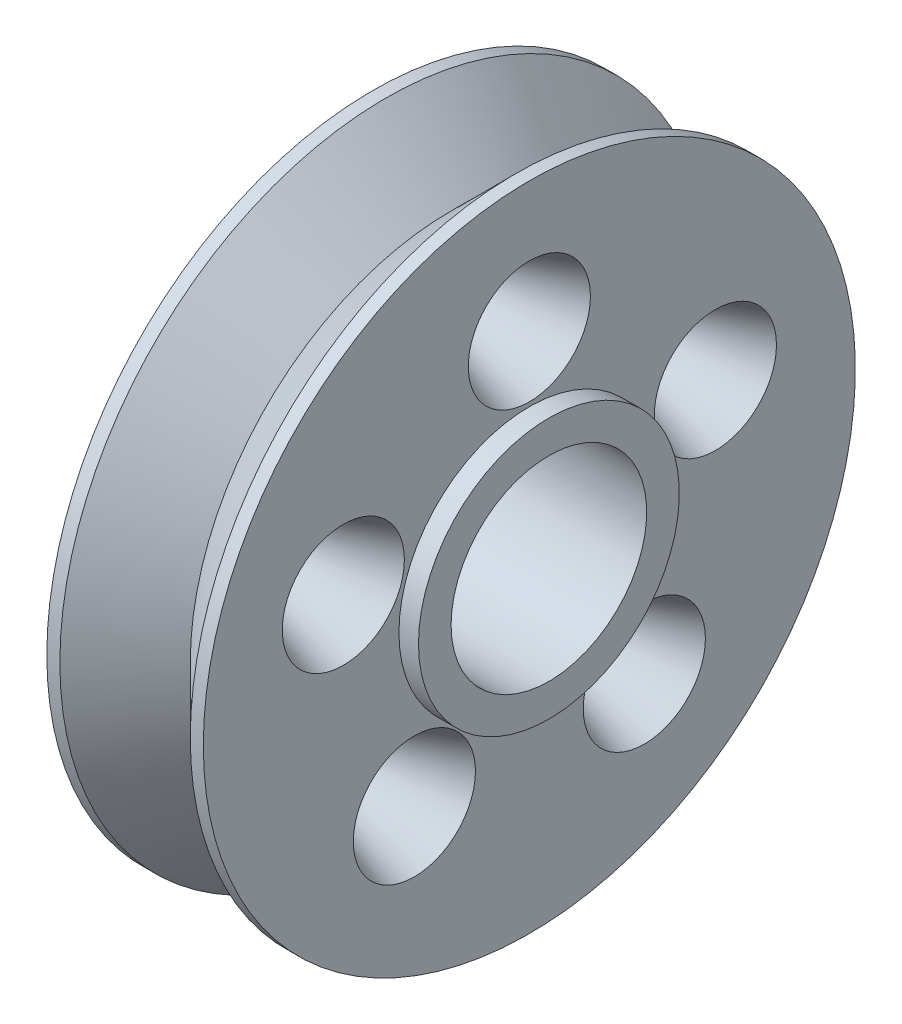
ISO-10303-21;
HEADER;
FILE_DESCRIPTION(('STEP AP214'),'2;1');
FILE_NAME('part.step','',(''),(''),'','','');
FILE_SCHEMA(('AUTOMOTIVE_DESIGN { 1 0 10303 214 1 1 1 1 }'));
ENDSEC;
DATA;
#1=APPLICATION_CONTEXT('core data for automotive mechanical design processes');
#2=APPLICATION_PROTOCOL_DEFINITION('international standard','automotive_design',2000,#1);
#3=PRODUCT_CONTEXT('',#1,'mechanical');
#4=PRODUCT('Part','Part','',(#3));
#5=PRODUCT_RELATED_PRODUCT_CATEGORY('part','',(#4));
#6=PRODUCT_DEFINITION_FORMATION('','',#4);
#7=PRODUCT_DEFINITION_CONTEXT('part definition',#1,'design');
#8=PRODUCT_DEFINITION('design','',#6,#7);
#9=PRODUCT_DEFINITION_SHAPE('','',#8);
#10=(LENGTH_UNIT() NAMED_UNIT(*) SI_UNIT(.MILLI.,.METRE.));
#11=(NAMED_UNIT(*) PLANE_ANGLE_UNIT() SI_UNIT($,.RADIAN.));
#12=(NAMED_UNIT(*) SI_UNIT($,.STERADIAN.) SOLID_ANGLE_UNIT());
#13=UNCERTAINTY_MEASURE_WITH_UNIT(LENGTH_MEASURE(1.E-05),#10,'distance_accuracy_value','');
#14=(GEOMETRIC_REPRESENTATION_CONTEXT(3) GLOBAL_UNCERTAINTY_ASSIGNED_CONTEXT((#13)) GLOBAL_UNIT_ASSIGNED_CONTEXT((#10,
#11,#12)) REPRESENTATION_CONTEXT('',''));
#15=CARTESIAN_POINT('',(0.,0.,0.));
#16=DIRECTION('',(0.,0.,1.));
#17=DIRECTION('',(1.,0.,0.));
#18=AXIS2_PLACEMENT_3D('',#15,#16,#17);
#19=CARTESIAN_POINT('',(-12.1366351418616,50.,0.));
#20=DIRECTION('',(1.,0.,0.));
#21=DIRECTION('',(0.,0.,-1.));
#22=AXIS2_PLACEMENT_3D('',#19,#20,#21);
#23=PLANE('',#22);
#24=CARTESIAN_POINT('',(-12.1366351418616,9.27050983124875,-28.5316954888545));
#25=DIRECTION('',(1.,0.,0.));
#26=DIRECTION('',(0.,0.,-1.));
#27=AXIS2_PLACEMENT_3D('',#24,#25,#26);
#28=CIRCLE('',#27,9.36764281119444);
#29=CARTESIAN_POINT('',(-12.1366351418616,9.27050983124875,-37.8993383000489));
#30=VERTEX_POINT('',#29);
#31=EDGE_CURVE('E128',#30,#30,#28,.T.);
#32=ORIENTED_EDGE('',*,*,#31,.T.);
#33=EDGE_LOOP('',(#32));
#34=FACE_BOUND('',#33,.T.);
#35=CARTESIAN_POINT('',(-12.1366351418616,-24.2705098312483,-17.6335575687744));
#36=DIRECTION('',(1.,0.,0.));
#37=DIRECTION('',(0.,0.,-1.));
#38=AXIS2_PLACEMENT_3D('',#35,#36,#37);
#39=CIRCLE('',#38,9.36764281119444);
#40=CARTESIAN_POINT('',(-12.1366351418616,-24.2705098312483,-27.0012003799688));
#41=VERTEX_POINT('',#40);
#42=EDGE_CURVE('E141',#41,#41,#39,.T.);
#43=ORIENTED_EDGE('',*,*,#42,.T.);
#44=EDGE_LOOP('',(#43));
#45=FACE_BOUND('',#44,.T.);
#46=CARTESIAN_POINT('',(-12.1366351418616,-24.2705098312485,17.6335575687741));
#47=DIRECTION('',(1.,0.,0.));
#48=DIRECTION('',(0.,0.,-1.));
#49=AXIS2_PLACEMENT_3D('',#46,#47,#48);
#50=CIRCLE('',#49,9.36764281119444);
#51=CARTESIAN_POINT('',(-12.1366351418616,-24.2705098312485,8.26591475757962));
#52=VERTEX_POINT('',#51);
#53=EDGE_CURVE('E151',#52,#52,#50,.T.);
#54=ORIENTED_EDGE('',*,*,#53,.T.);
#55=EDGE_LOOP('',(#54));
#56=FACE_BOUND('',#55,.T.);
#57=CARTESIAN_POINT('',(-12.1366351418616,9.27050983124834,28.5316954888546));
#58=DIRECTION('',(1.,0.,0.));
#59=DIRECTION('',(0.,0.,-1.));
#60=AXIS2_PLACEMENT_3D('',#57,#58,#59);
#61=CIRCLE('',#60,9.36764281119444);
#62=CARTESIAN_POINT('',(-12.1366351418616,9.27050983124834,19.1640526776602));
#63=VERTEX_POINT('',#62);
#64=EDGE_CURVE('E114',#63,#63,#61,.T.);
#65=ORIENTED_EDGE('',*,*,#64,.T.);
#66=EDGE_LOOP('',(#65));
#67=FACE_BOUND('',#66,.T.);
#68=CARTESIAN_POINT('',(-12.1366351418616,30.,0.));
#69=DIRECTION('',(1.,0.,0.));
#70=DIRECTION('',(0.,0.,-1.));
#71=AXIS2_PLACEMENT_3D('',#68,#69,#70);
#72=CIRCLE('',#71,9.36764281119444);
#73=CARTESIAN_POINT('',(-12.1366351418616,30.,-9.36764281119444));
#74=VERTEX_POINT('',#73);
#75=EDGE_CURVE('E102',#74,#74,#72,.T.);
#76=ORIENTED_EDGE('',*,*,#75,.T.);
#77=EDGE_LOOP('',(#76));
#78=FACE_BOUND('',#77,.T.);
#79=CARTESIAN_POINT('',(-12.1366351418616,0.,0.));
#80=DIRECTION('',(-1.,0.,0.));
#81=DIRECTION('',(0.,0.,1.));
#82=AXIS2_PLACEMENT_3D('',#79,#80,#81);
#83=CIRCLE('',#82,20.);
#84=CARTESIAN_POINT('',(-12.1366351418616,0.,20.));
#85=VERTEX_POINT('',#84);
#86=EDGE_CURVE('E94',#85,#85,#83,.T.);
#87=ORIENTED_EDGE('',*,*,#86,.F.);
#88=EDGE_LOOP('',(#87));
#89=FACE_BOUND('',#88,.T.);
#90=CARTESIAN_POINT('',(-12.1366351418616,0.,0.));
#91=DIRECTION('',(-1.,0.,0.));
#92=DIRECTION('',(0.,0.,1.));
#93=AXIS2_PLACEMENT_3D('',#90,#91,#92);
#94=CIRCLE('',#93,50.);
#95=CARTESIAN_POINT('',(-12.1366351418616,0.,50.));
#96=VERTEX_POINT('',#95);
#97=EDGE_CURVE('E10',#96,#96,#94,.T.);
#98=ORIENTED_EDGE('',*,*,#97,.T.);
#99=EDGE_LOOP('',(#98));
#100=FACE_BOUND('',#99,.T.);
#101=ADVANCED_FACE('F47',(#34,#45,#56,#67,#78,#89,#100),#23,.F.);
#102=CARTESIAN_POINT('',(-17.6767048282728,0.,0.));
#103=DIRECTION('',(-1.,0.,0.));
#104=DIRECTION('',(0.,0.,1.));
#105=AXIS2_PLACEMENT_3D('',#102,#103,#104);
#106=CYLINDRICAL_SURFACE('',#105,50.);
#107=ORIENTED_EDGE('',*,*,#97,.F.);
#108=EDGE_LOOP('',(#107));
#109=FACE_BOUND('',#108,.T.);
#110=CARTESIAN_POINT('',(-10.1366351418613,0.,0.));
#111=DIRECTION('',(-1.,0.,0.));
#112=DIRECTION('',(0.,0.,1.));
#113=AXIS2_PLACEMENT_3D('',#110,#111,#112);
#114=CIRCLE('',#113,50.);
#115=CARTESIAN_POINT('',(-10.1366351418613,0.,50.));
#116=VERTEX_POINT('',#115);
#117=EDGE_CURVE('E54',#116,#116,#114,.T.);
#118=ORIENTED_EDGE('',*,*,#117,.T.);
#119=EDGE_LOOP('',(#118));
#120=FACE_BOUND('',#119,.T.);
#121=ADVANCED_FACE('F178',(#109,#120),#106,.T.);
#122=CARTESIAN_POINT('',(-0.136635141861612,0.,0.));
#123=DIRECTION('',(-1.,0.,0.));
#124=DIRECTION('',(0.,0.,1.));
#125=AXIS2_PLACEMENT_3D('',#122,#123,#124);
#126=CONICAL_SURFACE('',#125,40.,0.785398163397464);
#127=ORIENTED_EDGE('',*,*,#117,.F.);
#128=EDGE_LOOP('',(#127));
#129=FACE_BOUND('',#128,.T.);
#130=CARTESIAN_POINT('',(-0.136635141861612,0.,0.));
#131=DIRECTION('',(-1.,0.,0.));
#132=DIRECTION('',(0.,0.,1.));
#133=AXIS2_PLACEMENT_3D('',#130,#131,#132);
#134=CIRCLE('',#133,40.);
#135=CARTESIAN_POINT('',(-0.136635141861612,0.,40.));
#136=VERTEX_POINT('',#135);
#137=EDGE_CURVE('E59',#136,#136,#134,.T.);
#138=ORIENTED_EDGE('',*,*,#137,.T.);
#139=EDGE_LOOP('',(#138));
#140=FACE_BOUND('',#139,.T.);
#141=ADVANCED_FACE('F183',(#129,#140),#126,.T.);
#142=CARTESIAN_POINT('',(9.86336485813861,0.,0.));
#143=DIRECTION('',(1.,0.,0.));
#144=DIRECTION('',(0.,0.,-1.));
#145=AXIS2_PLACEMENT_3D('',#142,#143,#144);
#146=CONICAL_SURFACE('',#145,50.,0.785398163397437);
#147=ORIENTED_EDGE('',*,*,#137,.F.);
#148=EDGE_LOOP('',(#147));
#149=FACE_BOUND('',#148,.T.);
#150=CARTESIAN_POINT('',(9.86336485813861,0.,0.));
#151=DIRECTION('',(-1.,0.,0.));
#152=DIRECTION('',(0.,0.,1.));
#153=AXIS2_PLACEMENT_3D('',#150,#151,#152);
#154=CIRCLE('',#153,50.);
#155=CARTESIAN_POINT('',(9.86336485813861,0.,50.));
#156=VERTEX_POINT('',#155);
#157=EDGE_CURVE('E64',#156,#156,#154,.T.);
#158=ORIENTED_EDGE('',*,*,#157,.T.);
#159=EDGE_LOOP('',(#158));
#160=FACE_BOUND('',#159,.T.);
#161=ADVANCED_FACE('F234',(#149,#160),#146,.T.);
#162=CARTESIAN_POINT('',(-17.6767048282728,0.,0.));
#163=DIRECTION('',(-1.,0.,0.));
#164=DIRECTION('',(0.,0.,1.));
#165=AXIS2_PLACEMENT_3D('',#162,#163,#164);
#166=CYLINDRICAL_SURFACE('',#165,50.);
#167=ORIENTED_EDGE('',*,*,#157,.F.);
#168=EDGE_LOOP('',(#167));
#169=FACE_BOUND('',#168,.T.);
#170=CARTESIAN_POINT('',(11.8633648581384,0.,0.));
#171=DIRECTION('',(-1.,0.,0.));
#172=DIRECTION('',(0.,0.,1.));
#173=AXIS2_PLACEMENT_3D('',#170,#171,#172);
#174=CIRCLE('',#173,50.);
#175=CARTESIAN_POINT('',(11.8633648581384,0.,50.));
#176=VERTEX_POINT('',#175);
#177=EDGE_CURVE('E70',#176,#176,#174,.T.);
#178=ORIENTED_EDGE('',*,*,#177,.T.);
#179=EDGE_LOOP('',(#178));
#180=FACE_BOUND('',#179,.T.);
#181=ADVANCED_FACE('F230',(#169,#180),#166,.T.);
#182=CARTESIAN_POINT('',(11.8633648581384,50.,0.));
#183=DIRECTION('',(-1.,0.,0.));
#184=DIRECTION('',(0.,0.,1.));
#185=AXIS2_PLACEMENT_3D('',#182,#183,#184);
#186=PLANE('',#185);
#187=CARTESIAN_POINT('',(11.8633648581384,9.27050983124875,-28.5316954888545));
#188=DIRECTION('',(1.,0.,0.));
#189=DIRECTION('',(0.,0.,-1.));
#190=AXIS2_PLACEMENT_3D('',#187,#188,#189);
#191=CIRCLE('',#190,9.36764281119444);
#192=CARTESIAN_POINT('',(11.8633648581384,9.27050983124875,-37.8993383000489));
#193=VERTEX_POINT('',#192);
#194=EDGE_CURVE('E123',#193,#193,#191,.T.);
#195=ORIENTED_EDGE('',*,*,#194,.F.);
#196=EDGE_LOOP('',(#195));
#197=FACE_BOUND('',#196,.T.);
#198=CARTESIAN_POINT('',(11.8633648581384,-24.2705098312483,-17.6335575687744));
#199=DIRECTION('',(1.,0.,0.));
#200=DIRECTION('',(0.,0.,-1.));
#201=AXIS2_PLACEMENT_3D('',#198,#199,#200);
#202=CIRCLE('',#201,9.36764281119444);
#203=CARTESIAN_POINT('',(11.8633648581384,-24.2705098312483,-27.0012003799688));
#204=VERTEX_POINT('',#203);
#205=EDGE_CURVE('E136',#204,#204,#202,.T.);
#206=ORIENTED_EDGE('',*,*,#205,.F.);
#207=EDGE_LOOP('',(#206));
#208=FACE_BOUND('',#207,.T.);
#209=CARTESIAN_POINT('',(11.8633648581384,-24.2705098312485,17.6335575687741));
#210=DIRECTION('',(1.,0.,0.));
#211=DIRECTION('',(0.,0.,-1.));
#212=AXIS2_PLACEMENT_3D('',#209,#210,#211);
#213=CIRCLE('',#212,9.36764281119444);
#214=CARTESIAN_POINT('',(11.8633648581384,-24.2705098312485,8.26591475757962));
#215=VERTEX_POINT('',#214);
#216=EDGE_CURVE('E122',#215,#215,#213,.T.);
#217=ORIENTED_EDGE('',*,*,#216,.F.);
#218=EDGE_LOOP('',(#217));
#219=FACE_BOUND('',#218,.T.);
#220=CARTESIAN_POINT('',(11.8633648581384,9.27050983124834,28.5316954888546));
#221=DIRECTION('',(1.,0.,0.));
#222=DIRECTION('',(0.,0.,-1.));
#223=AXIS2_PLACEMENT_3D('',#220,#221,#222);
#224=CIRCLE('',#223,9.36764281119444);
#225=CARTESIAN_POINT('',(11.8633648581384,9.27050983124834,19.1640526776602));
#226=VERTEX_POINT('',#225);
#227=EDGE_CURVE('E110',#226,#226,#224,.T.);
#228=ORIENTED_EDGE('',*,*,#227,.F.);
#229=EDGE_LOOP('',(#228));
#230=FACE_BOUND('',#229,.T.);
#231=CARTESIAN_POINT('',(11.8633648581384,30.,0.));
#232=DIRECTION('',(1.,0.,0.));
#233=DIRECTION('',(0.,0.,-1.));
#234=AXIS2_PLACEMENT_3D('',#231,#232,#233);
#235=CIRCLE('',#234,9.36764281119444);
#236=CARTESIAN_POINT('',(11.8633648581384,30.,-9.36764281119444));
#237=VERTEX_POINT('',#236);
#238=EDGE_CURVE('E98',#237,#237,#235,.T.);
#239=ORIENTED_EDGE('',*,*,#238,.F.);
#240=EDGE_LOOP('',(#239));
#241=FACE_BOUND('',#240,.T.);
#242=ORIENTED_EDGE('',*,*,#177,.F.);
#243=EDGE_LOOP('',(#242));
#244=FACE_BOUND('',#243,.T.);
#245=CARTESIAN_POINT('',(11.8633648581384,0.,0.));
#246=DIRECTION('',(-1.,0.,0.));
#247=DIRECTION('',(0.,0.,1.));
#248=AXIS2_PLACEMENT_3D('',#245,#246,#247);
#249=CIRCLE('',#248,20.);
#250=CARTESIAN_POINT('',(11.8633648581384,0.,20.));
#251=VERTEX_POINT('',#250);
#252=EDGE_CURVE('E74',#251,#251,#249,.T.);
#253=ORIENTED_EDGE('',*,*,#252,.T.);
#254=EDGE_LOOP('',(#253));
#255=FACE_BOUND('',#254,.T.);
#256=ADVANCED_FACE('F226',(#197,#208,#219,#230,#241,#244,#255),#186,.F.);
#257=CARTESIAN_POINT('',(-17.6767048282728,0.,0.));
#258=DIRECTION('',(-1.,0.,0.));
#259=DIRECTION('',(0.,0.,1.));
#260=AXIS2_PLACEMENT_3D('',#257,#258,#259);
#261=CYLINDRICAL_SURFACE('',#260,20.);
#262=ORIENTED_EDGE('',*,*,#252,.F.);
#263=EDGE_LOOP('',(#262));
#264=FACE_BOUND('',#263,.T.);
#265=CARTESIAN_POINT('',(14.8633648581384,0.,0.));
#266=DIRECTION('',(-1.,0.,0.));
#267=DIRECTION('',(0.,0.,1.));
#268=AXIS2_PLACEMENT_3D('',#265,#266,#267);
#269=CIRCLE('',#268,20.);
#270=CARTESIAN_POINT('',(14.8633648581384,0.,20.));
#271=VERTEX_POINT('',#270);
#272=EDGE_CURVE('E78',#271,#271,#269,.T.);
#273=ORIENTED_EDGE('',*,*,#272,.T.);
#274=EDGE_LOOP('',(#273));
#275=FACE_BOUND('',#274,.T.);
#276=ADVANCED_FACE('F222',(#264,#275),#261,.T.);
#277=CARTESIAN_POINT('',(14.8633648581384,15.,0.));
#278=DIRECTION('',(-1.,0.,0.));
#279=DIRECTION('',(0.,0.,1.));
#280=AXIS2_PLACEMENT_3D('',#277,#278,#279);
#281=PLANE('',#280);
#282=ORIENTED_EDGE('',*,*,#272,.F.);
#283=EDGE_LOOP('',(#282));
#284=FACE_BOUND('',#283,.T.);
#285=CARTESIAN_POINT('',(14.8633648581384,0.,0.));
#286=DIRECTION('',(-1.,0.,0.));
#287=DIRECTION('',(0.,0.,1.));
#288=AXIS2_PLACEMENT_3D('',#285,#286,#287);
#289=CIRCLE('',#288,15.);
#290=CARTESIAN_POINT('',(14.8633648581384,0.,15.));
#291=VERTEX_POINT('',#290);
#292=EDGE_CURVE('E82',#291,#291,#289,.T.);
#293=ORIENTED_EDGE('',*,*,#292,.T.);
#294=EDGE_LOOP('',(#293));
#295=FACE_BOUND('',#294,.T.);
#296=ADVANCED_FACE('F218',(#284,#295),#281,.F.);
#297=CARTESIAN_POINT('',(-17.6767048282728,0.,0.));
#298=DIRECTION('',(-1.,0.,0.));
#299=DIRECTION('',(0.,0.,1.));
#300=AXIS2_PLACEMENT_3D('',#297,#298,#299);
#301=CYLINDRICAL_SURFACE('',#300,15.);
#302=ORIENTED_EDGE('',*,*,#292,.F.);
#303=EDGE_LOOP('',(#302));
#304=FACE_BOUND('',#303,.T.);
#305=CARTESIAN_POINT('',(-15.1366351418616,0.,0.));
#306=DIRECTION('',(-1.,0.,0.));
#307=DIRECTION('',(0.,0.,1.));
#308=AXIS2_PLACEMENT_3D('',#305,#306,#307);
#309=CIRCLE('',#308,15.);
#310=CARTESIAN_POINT('',(-15.1366351418616,0.,15.));
#311=VERTEX_POINT('',#310);
#312=EDGE_CURVE('E86',#311,#311,#309,.T.);
#313=ORIENTED_EDGE('',*,*,#312,.T.);
#314=EDGE_LOOP('',(#313));
#315=FACE_BOUND('',#314,.T.);
#316=ADVANCED_FACE('F210',(#304,#315),#301,.F.);
#317=CARTESIAN_POINT('',(-15.1366351418616,15.,0.));
#318=DIRECTION('',(1.,0.,0.));
#319=DIRECTION('',(0.,0.,-1.));
#320=AXIS2_PLACEMENT_3D('',#317,#318,#319);
#321=PLANE('',#320);
#322=ORIENTED_EDGE('',*,*,#312,.F.);
#323=EDGE_LOOP('',(#322));
#324=FACE_BOUND('',#323,.T.);
#325=CARTESIAN_POINT('',(-15.1366351418616,0.,0.));
#326=DIRECTION('',(-1.,0.,0.));
#327=DIRECTION('',(0.,0.,1.));
#328=AXIS2_PLACEMENT_3D('',#325,#326,#327);
#329=CIRCLE('',#328,20.);
#330=CARTESIAN_POINT('',(-15.1366351418616,0.,20.));
#331=VERTEX_POINT('',#330);
#332=EDGE_CURVE('E90',#331,#331,#329,.T.);
#333=ORIENTED_EDGE('',*,*,#332,.T.);
#334=EDGE_LOOP('',(#333));
#335=FACE_BOUND('',#334,.T.);
#336=ADVANCED_FACE('F200',(#324,#335),#321,.F.);
#337=CARTESIAN_POINT('',(-17.6767048282728,0.,0.));
#338=DIRECTION('',(-1.,0.,0.));
#339=DIRECTION('',(0.,0.,1.));
#340=AXIS2_PLACEMENT_3D('',#337,#338,#339);
#341=CYLINDRICAL_SURFACE('',#340,20.);
#342=ORIENTED_EDGE('',*,*,#332,.F.);
#343=EDGE_LOOP('',(#342));
#344=FACE_BOUND('',#343,.T.);
#345=ORIENTED_EDGE('',*,*,#86,.T.);
#346=EDGE_LOOP('',(#345));
#347=FACE_BOUND('',#346,.T.);
#348=ADVANCED_FACE('F197',(#344,#347),#341,.T.);
#349=CARTESIAN_POINT('',(-0.136635141861627,30.,0.));
#350=DIRECTION('',(1.,0.,0.));
#351=DIRECTION('',(0.,0.,-1.));
#352=AXIS2_PLACEMENT_3D('',#349,#350,#351);
#353=CONICAL_SURFACE('',#352,5.,0.349065850398867);
#354=ORIENTED_EDGE('',*,*,#238,.T.);
#355=EDGE_LOOP('',(#354));
#356=FACE_BOUND('',#355,.T.);
#357=CARTESIAN_POINT('',(-0.136635141861627,30.,0.));
#358=DIRECTION('',(1.,0.,0.));
#359=DIRECTION('',(0.,0.,-1.));
#360=AXIS2_PLACEMENT_3D('',#357,#358,#359);
#361=CIRCLE('',#360,5.);
#362=CARTESIAN_POINT('',(-0.136635141861627,30.,-5.));
#363=VERTEX_POINT('',#362);
#364=EDGE_CURVE('E106',#363,#363,#361,.T.);
#365=ORIENTED_EDGE('',*,*,#364,.F.);
#366=EDGE_LOOP('',(#365));
#367=FACE_BOUND('',#366,.T.);
#368=ADVANCED_FACE('F199',(#356,#367),#353,.F.);
#369=CARTESIAN_POINT('',(-0.136635141861627,30.,0.));
#370=DIRECTION('',(-1.,0.,0.));
#371=DIRECTION('',(0.,0.,-1.));
#372=AXIS2_PLACEMENT_3D('',#369,#370,#371);
#373=CONICAL_SURFACE('',#372,5.,0.349065850398867);
#374=ORIENTED_EDGE('',*,*,#75,.F.);
#375=EDGE_LOOP('',(#374));
#376=FACE_BOUND('',#375,.T.);
#377=ORIENTED_EDGE('',*,*,#364,.T.);
#378=EDGE_LOOP('',(#377));
#379=FACE_BOUND('',#378,.T.);
#380=ADVANCED_FACE('F207',(#376,#379),#373,.F.);
#381=CARTESIAN_POINT('',(-0.136635141861627,9.27050983124834,28.5316954888546));
#382=DIRECTION('',(1.,0.,0.));
#383=DIRECTION('',(0.,0.951056516295155,-0.309016994374945));
#384=AXIS2_PLACEMENT_3D('',#381,#382,#383);
#385=CONICAL_SURFACE('',#384,5.,0.349065850398867);
#386=ORIENTED_EDGE('',*,*,#227,.T.);
#387=EDGE_LOOP('',(#386));
#388=FACE_BOUND('',#387,.T.);
#389=CARTESIAN_POINT('',(-0.136635141861627,9.27050983124834,28.5316954888546));
#390=DIRECTION('',(1.,0.,0.));
#391=DIRECTION('',(0.,0.951056516295155,-0.309016994374945));
#392=AXIS2_PLACEMENT_3D('',#389,#390,#391);
#393=CIRCLE('',#392,5.);
#394=CARTESIAN_POINT('',(-0.136635141861627,14.0257924127241,26.9866105169799));
#395=VERTEX_POINT('',#394);
#396=EDGE_CURVE('E118',#395,#395,#393,.T.);
#397=ORIENTED_EDGE('',*,*,#396,.F.);
#398=EDGE_LOOP('',(#397));
#399=FACE_BOUND('',#398,.T.);
#400=ADVANCED_FACE('F173',(#388,#399),#385,.F.);
#401=CARTESIAN_POINT('',(-0.136635141861627,9.27050983124834,28.5316954888546));
#402=DIRECTION('',(-1.,0.,0.));
#403=DIRECTION('',(0.,0.951056516295155,-0.309016994374945));
#404=AXIS2_PLACEMENT_3D('',#401,#402,#403);
#405=CONICAL_SURFACE('',#404,5.,0.349065850398867);
#406=ORIENTED_EDGE('',*,*,#64,.F.);
#407=EDGE_LOOP('',(#406));
#408=FACE_BOUND('',#407,.T.);
#409=ORIENTED_EDGE('',*,*,#396,.T.);
#410=EDGE_LOOP('',(#409));
#411=FACE_BOUND('',#410,.T.);
#412=ADVANCED_FACE('F163',(#408,#411),#405,.F.);
#413=CARTESIAN_POINT('',(-0.136635141861627,-24.2705098312485,17.6335575687741));
#414=DIRECTION('',(1.,0.,0.));
#415=DIRECTION('',(0.,0.587785252292469,0.809016994374951));
#416=AXIS2_PLACEMENT_3D('',#413,#414,#415);
#417=CONICAL_SURFACE('',#416,5.,0.349065850398867);
#418=ORIENTED_EDGE('',*,*,#216,.T.);
#419=EDGE_LOOP('',(#418));
#420=FACE_BOUND('',#419,.T.);
#421=CARTESIAN_POINT('',(-0.136635141861627,-24.2705098312485,17.6335575687741));
#422=DIRECTION('',(1.,0.,0.));
#423=DIRECTION('',(0.,0.587785252292469,0.809016994374951));
#424=AXIS2_PLACEMENT_3D('',#421,#422,#423);
#425=CIRCLE('',#424,5.);
#426=CARTESIAN_POINT('',(-0.136635141861627,-21.3315835697862,21.6786425406488));
#427=VERTEX_POINT('',#426);
#428=EDGE_CURVE('E140',#427,#427,#425,.T.);
#429=ORIENTED_EDGE('',*,*,#428,.F.);
#430=EDGE_LOOP('',(#429));
#431=FACE_BOUND('',#430,.T.);
#432=ADVANCED_FACE('F161',(#420,#431),#417,.F.);
#433=CARTESIAN_POINT('',(-0.136635141861627,-24.2705098312485,17.6335575687741));
#434=DIRECTION('',(-1.,0.,0.));
#435=DIRECTION('',(0.,0.587785252292469,0.809016994374951));
#436=AXIS2_PLACEMENT_3D('',#433,#434,#435);
#437=CONICAL_SURFACE('',#436,5.,0.349065850398867);
#438=ORIENTED_EDGE('',*,*,#53,.F.);
#439=EDGE_LOOP('',(#438));
#440=FACE_BOUND('',#439,.T.);
#441=ORIENTED_EDGE('',*,*,#428,.T.);
#442=EDGE_LOOP('',(#441));
#443=FACE_BOUND('',#442,.T.);
#444=ADVANCED_FACE('F159',(#440,#443),#437,.F.);
#445=CARTESIAN_POINT('',(-0.136635141861627,-24.2705098312483,-17.6335575687744));
#446=DIRECTION('',(1.,0.,0.));
#447=DIRECTION('',(0.,-0.58778525229248,0.809016994374942));
#448=AXIS2_PLACEMENT_3D('',#445,#446,#447);
#449=CONICAL_SURFACE('',#448,5.,0.349065850398867);
#450=ORIENTED_EDGE('',*,*,#205,.T.);
#451=EDGE_LOOP('',(#450));
#452=FACE_BOUND('',#451,.T.);
#453=CARTESIAN_POINT('',(-0.136635141861627,-24.2705098312483,-17.6335575687744));
#454=DIRECTION('',(1.,0.,0.));
#455=DIRECTION('',(0.,-0.58778525229248,0.809016994374942));
#456=AXIS2_PLACEMENT_3D('',#453,#454,#455);
#457=CIRCLE('',#456,5.);
#458=CARTESIAN_POINT('',(-0.136635141861627,-27.2094360927107,-13.5884725968997));
#459=VERTEX_POINT('',#458);
#460=EDGE_CURVE('E127',#459,#459,#457,.T.);
#461=ORIENTED_EDGE('',*,*,#460,.F.);
#462=EDGE_LOOP('',(#461));
#463=FACE_BOUND('',#462,.T.);
#464=ADVANCED_FACE('F170',(#452,#463),#449,.F.);
#465=CARTESIAN_POINT('',(-0.136635141861627,-24.2705098312483,-17.6335575687744));
#466=DIRECTION('',(-1.,0.,0.));
#467=DIRECTION('',(0.,-0.58778525229248,0.809016994374942));
#468=AXIS2_PLACEMENT_3D('',#465,#466,#467);
#469=CONICAL_SURFACE('',#468,5.,0.349065850398867);
#470=ORIENTED_EDGE('',*,*,#42,.F.);
#471=EDGE_LOOP('',(#470));
#472=FACE_BOUND('',#471,.T.);
#473=ORIENTED_EDGE('',*,*,#460,.T.);
#474=EDGE_LOOP('',(#473));
#475=FACE_BOUND('',#474,.T.);
#476=ADVANCED_FACE('F342',(#472,#475),#469,.F.);
#477=CARTESIAN_POINT('',(-0.136635141861627,9.27050983124875,-28.5316954888545));
#478=DIRECTION('',(1.,0.,0.));
#479=DIRECTION('',(0.,-0.95105651629515,-0.309016994374958));
#480=AXIS2_PLACEMENT_3D('',#477,#478,#479);
#481=CONICAL_SURFACE('',#480,5.,0.349065850398867);
#482=ORIENTED_EDGE('',*,*,#194,.T.);
#483=EDGE_LOOP('',(#482));
#484=FACE_BOUND('',#483,.T.);
#485=CARTESIAN_POINT('',(-0.136635141861627,9.27050983124875,-28.5316954888545));
#486=DIRECTION('',(1.,0.,0.));
#487=DIRECTION('',(0.,-0.95105651629515,-0.309016994374958));
#488=AXIS2_PLACEMENT_3D('',#485,#486,#487);
#489=CIRCLE('',#488,5.);
#490=CARTESIAN_POINT('',(-0.136635141861627,4.515227249773,-30.0767804607293));
#491=VERTEX_POINT('',#490);
#492=EDGE_CURVE('E132',#491,#491,#489,.T.);
#493=ORIENTED_EDGE('',*,*,#492,.F.);
#494=EDGE_LOOP('',(#493));
#495=FACE_BOUND('',#494,.T.);
#496=ADVANCED_FACE('F352',(#484,#495),#481,.F.);
#497=CARTESIAN_POINT('',(-0.136635141861627,9.27050983124875,-28.5316954888545));
#498=DIRECTION('',(-1.,0.,0.));
#499=DIRECTION('',(0.,-0.95105651629515,-0.309016994374958));
#500=AXIS2_PLACEMENT_3D('',#497,#498,#499);
#501=CONICAL_SURFACE('',#500,5.,0.349065850398867);
#502=ORIENTED_EDGE('',*,*,#31,.F.);
#503=EDGE_LOOP('',(#502));
#504=FACE_BOUND('',#503,.T.);
#505=ORIENTED_EDGE('',*,*,#492,.T.);
#506=EDGE_LOOP('',(#505));
#507=FACE_BOUND('',#506,.T.);
#508=ADVANCED_FACE('F361',(#504,#507),#501,.F.);
#509=CLOSED_SHELL('',(#101,#121,#141,#161,#181,#256,#276,#296,#316,#336,#348,#368,#380,#400,
#412,#432,#444,#464,#476,#496,#508));
#510=MANIFOLD_SOLID_BREP('B2',#509);
#511=ADVANCED_BREP_SHAPE_REPRESENTATION('',(#18,#510),#14);
#512=SHAPE_DEFINITION_REPRESENTATION(#9,#511);
ENDSEC;
END-ISO-10303-21;
